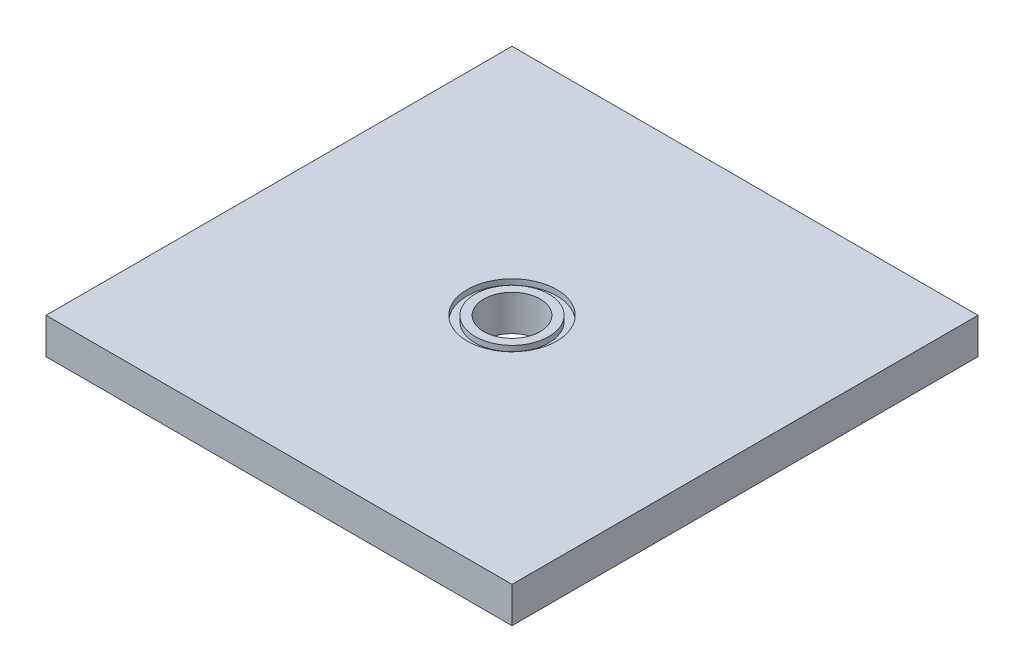
ISO-10303-21;
HEADER;
FILE_DESCRIPTION(('STEP AP214'),'2;1');
FILE_NAME('part.step','',(''),(''),'','','');
FILE_SCHEMA(('AUTOMOTIVE_DESIGN { 1 0 10303 214 1 1 1 1 }'));
ENDSEC;
DATA;
#1=APPLICATION_CONTEXT('core data for automotive mechanical design processes');
#2=APPLICATION_PROTOCOL_DEFINITION('international standard','automotive_design',2000,#1);
#3=PRODUCT_CONTEXT('',#1,'mechanical');
#4=PRODUCT('Part','Part','',(#3));
#5=PRODUCT_RELATED_PRODUCT_CATEGORY('part','',(#4));
#6=PRODUCT_DEFINITION_FORMATION('','',#4);
#7=PRODUCT_DEFINITION_CONTEXT('part definition',#1,'design');
#8=PRODUCT_DEFINITION('design','',#6,#7);
#9=PRODUCT_DEFINITION_SHAPE('','',#8);
#10=(LENGTH_UNIT() NAMED_UNIT(*) SI_UNIT(.MILLI.,.METRE.));
#11=(NAMED_UNIT(*) PLANE_ANGLE_UNIT() SI_UNIT($,.RADIAN.));
#12=(NAMED_UNIT(*) SI_UNIT($,.STERADIAN.) SOLID_ANGLE_UNIT());
#13=UNCERTAINTY_MEASURE_WITH_UNIT(LENGTH_MEASURE(1.E-05),#10,'distance_accuracy_value','');
#14=(GEOMETRIC_REPRESENTATION_CONTEXT(3) GLOBAL_UNCERTAINTY_ASSIGNED_CONTEXT((#13)) GLOBAL_UNIT_ASSIGNED_CONTEXT((#10,
#11,#12)) REPRESENTATION_CONTEXT('',''));
#15=CARTESIAN_POINT('',(0.,0.,0.));
#16=DIRECTION('',(0.,0.,1.));
#17=DIRECTION('',(1.,0.,0.));
#18=AXIS2_PLACEMENT_3D('',#15,#16,#17);
#19=CARTESIAN_POINT('',(0.,6.35,0.));
#20=DIRECTION('',(0.,-1.,0.));
#21=DIRECTION('',(0.,0.,-1.));
#22=AXIS2_PLACEMENT_3D('',#19,#20,#21);
#23=PLANE('',#22);
#24=CARTESIAN_POINT('',(0.,6.35,0.));
#25=DIRECTION('',(0.,1.,0.));
#26=DIRECTION('',(0.,0.,1.));
#27=AXIS2_PLACEMENT_3D('',#24,#25,#26);
#28=CIRCLE('',#27,4.99999);
#29=CARTESIAN_POINT('',(0.,6.35,4.99999));
#30=VERTEX_POINT('',#29);
#31=EDGE_CURVE('E100',#30,#30,#28,.T.);
#32=ORIENTED_EDGE('',*,*,#31,.F.);
#33=EDGE_LOOP('',(#32));
#34=FACE_BOUND('',#33,.T.);
#35=CARTESIAN_POINT('',(0.,6.35,0.));
#36=DIRECTION('',(0.,1.,0.));
#37=DIRECTION('',(0.,0.,1.));
#38=AXIS2_PLACEMENT_3D('',#35,#36,#37);
#39=CIRCLE('',#38,6.5278);
#40=CARTESIAN_POINT('',(0.,6.35,6.5278));
#41=VERTEX_POINT('',#40);
#42=EDGE_CURVE('E123',#41,#41,#39,.T.);
#43=ORIENTED_EDGE('',*,*,#42,.T.);
#44=EDGE_LOOP('',(#43));
#45=FACE_BOUND('',#44,.T.);
#46=ADVANCED_FACE('F33',(#34,#45),#23,.F.);
#47=CARTESIAN_POINT('',(41.275,6.35,41.275));
#48=DIRECTION('',(-1.,0.,0.));
#49=DIRECTION('',(0.,0.,1.));
#50=AXIS2_PLACEMENT_3D('',#47,#48,#49);
#51=PLANE('',#50);
#52=DIRECTION('',(0.,0.,-1.));
#53=VECTOR('',#52,1.);
#54=CARTESIAN_POINT('',(41.275,0.,41.275));
#55=LINE('',#54,#53);
#56=CARTESIAN_POINT('',(41.275,0.,41.275));
#57=VERTEX_POINT('',#56);
#58=CARTESIAN_POINT('',(41.275,0.,-41.275));
#59=VERTEX_POINT('',#58);
#60=EDGE_CURVE('E97',#57,#59,#55,.T.);
#61=ORIENTED_EDGE('',*,*,#60,.T.);
#62=DIRECTION('',(0.,-1.,0.));
#63=VECTOR('',#62,1.);
#64=CARTESIAN_POINT('',(41.275,6.35,-41.275));
#65=LINE('',#64,#63);
#66=CARTESIAN_POINT('',(41.275,6.35,-41.275));
#67=VERTEX_POINT('',#66);
#68=EDGE_CURVE('E11',#67,#59,#65,.T.);
#69=ORIENTED_EDGE('',*,*,#68,.F.);
#70=DIRECTION('',(0.,0.,-1.));
#71=VECTOR('',#70,1.);
#72=CARTESIAN_POINT('',(41.275,6.35,41.275));
#73=LINE('',#72,#71);
#74=CARTESIAN_POINT('',(41.275,6.35,41.275));
#75=VERTEX_POINT('',#74);
#76=EDGE_CURVE('E85',#75,#67,#73,.T.);
#77=ORIENTED_EDGE('',*,*,#76,.F.);
#78=DIRECTION('',(0.,-1.,0.));
#79=VECTOR('',#78,1.);
#80=CARTESIAN_POINT('',(41.275,6.35,41.275));
#81=LINE('',#80,#79);
#82=EDGE_CURVE('E93',#75,#57,#81,.T.);
#83=ORIENTED_EDGE('',*,*,#82,.T.);
#84=EDGE_LOOP('',(#61,#69,#77,#83));
#85=FACE_BOUND('',#84,.T.);
#86=ADVANCED_FACE('F35',(#85),#51,.F.);
#87=CARTESIAN_POINT('',(-41.275,6.35,-41.275));
#88=DIRECTION('',(0.,0.,1.));
#89=DIRECTION('',(1.,0.,0.));
#90=AXIS2_PLACEMENT_3D('',#87,#88,#89);
#91=PLANE('',#90);
#92=DIRECTION('',(-1.,0.,0.));
#93=VECTOR('',#92,1.);
#94=CARTESIAN_POINT('',(-41.275,0.,-41.275));
#95=LINE('',#94,#93);
#96=CARTESIAN_POINT('',(-41.275,0.,-41.275));
#97=VERTEX_POINT('',#96);
#98=EDGE_CURVE('E89',#59,#97,#95,.T.);
#99=ORIENTED_EDGE('',*,*,#98,.T.);
#100=DIRECTION('',(0.,-1.,0.));
#101=VECTOR('',#100,1.);
#102=CARTESIAN_POINT('',(-41.275,6.35,-41.275));
#103=LINE('',#102,#101);
#104=CARTESIAN_POINT('',(-41.275,6.35,-41.275));
#105=VERTEX_POINT('',#104);
#106=EDGE_CURVE('E42',#105,#97,#103,.T.);
#107=ORIENTED_EDGE('',*,*,#106,.F.);
#108=DIRECTION('',(-1.,0.,0.));
#109=VECTOR('',#108,1.);
#110=CARTESIAN_POINT('',(-41.275,6.35,-41.275));
#111=LINE('',#110,#109);
#112=EDGE_CURVE('E80',#67,#105,#111,.T.);
#113=ORIENTED_EDGE('',*,*,#112,.F.);
#114=ORIENTED_EDGE('',*,*,#68,.T.);
#115=EDGE_LOOP('',(#99,#107,#113,#114));
#116=FACE_BOUND('',#115,.T.);
#117=ADVANCED_FACE('F88',(#116),#91,.F.);
#118=CARTESIAN_POINT('',(-41.275,6.35,41.275));
#119=DIRECTION('',(1.,0.,0.));
#120=DIRECTION('',(0.,0.,-1.));
#121=AXIS2_PLACEMENT_3D('',#118,#119,#120);
#122=PLANE('',#121);
#123=DIRECTION('',(0.,0.,1.));
#124=VECTOR('',#123,1.);
#125=CARTESIAN_POINT('',(-41.275,0.,41.275));
#126=LINE('',#125,#124);
#127=CARTESIAN_POINT('',(-41.275,0.,41.275));
#128=VERTEX_POINT('',#127);
#129=EDGE_CURVE('E67',#97,#128,#126,.T.);
#130=ORIENTED_EDGE('',*,*,#129,.T.);
#131=DIRECTION('',(0.,-1.,0.));
#132=VECTOR('',#131,1.);
#133=CARTESIAN_POINT('',(-41.275,6.35,41.275));
#134=LINE('',#133,#132);
#135=CARTESIAN_POINT('',(-41.275,6.35,41.275));
#136=VERTEX_POINT('',#135);
#137=EDGE_CURVE('E90',#136,#128,#134,.T.);
#138=ORIENTED_EDGE('',*,*,#137,.F.);
#139=DIRECTION('',(0.,0.,1.));
#140=VECTOR('',#139,1.);
#141=CARTESIAN_POINT('',(-41.275,6.35,41.275));
#142=LINE('',#141,#140);
#143=EDGE_CURVE('E83',#105,#136,#142,.T.);
#144=ORIENTED_EDGE('',*,*,#143,.F.);
#145=ORIENTED_EDGE('',*,*,#106,.T.);
#146=EDGE_LOOP('',(#130,#138,#144,#145));
#147=FACE_BOUND('',#146,.T.);
#148=ADVANCED_FACE('F91',(#147),#122,.F.);
#149=CARTESIAN_POINT('',(-41.275,6.35,41.275));
#150=DIRECTION('',(0.,0.,-1.));
#151=DIRECTION('',(-1.,0.,0.));
#152=AXIS2_PLACEMENT_3D('',#149,#150,#151);
#153=PLANE('',#152);
#154=DIRECTION('',(1.,0.,0.));
#155=VECTOR('',#154,1.);
#156=CARTESIAN_POINT('',(-41.275,0.,41.275));
#157=LINE('',#156,#155);
#158=EDGE_CURVE('E73',#128,#57,#157,.T.);
#159=ORIENTED_EDGE('',*,*,#158,.T.);
#160=ORIENTED_EDGE('',*,*,#82,.F.);
#161=DIRECTION('',(1.,0.,0.));
#162=VECTOR('',#161,1.);
#163=CARTESIAN_POINT('',(-41.275,6.35,41.275));
#164=LINE('',#163,#162);
#165=EDGE_CURVE('E50',#136,#75,#164,.T.);
#166=ORIENTED_EDGE('',*,*,#165,.F.);
#167=ORIENTED_EDGE('',*,*,#137,.T.);
#168=EDGE_LOOP('',(#159,#160,#166,#167));
#169=FACE_BOUND('',#168,.T.);
#170=ADVANCED_FACE('F105',(#169),#153,.F.);
#171=CARTESIAN_POINT('',(0.,6.35,0.));
#172=DIRECTION('',(0.,1.,0.));
#173=DIRECTION('',(0.,0.,1.));
#174=AXIS2_PLACEMENT_3D('',#171,#172,#173);
#175=CIRCLE('',#174,7.9248);
#176=CARTESIAN_POINT('',(0.,6.35,7.9248));
#177=VERTEX_POINT('',#176);
#178=EDGE_CURVE('E117',#177,#177,#175,.T.);
#179=ORIENTED_EDGE('',*,*,#178,.F.);
#180=EDGE_LOOP('',(#179));
#181=FACE_BOUND('',#180,.T.);
#182=ORIENTED_EDGE('',*,*,#76,.T.);
#183=ORIENTED_EDGE('',*,*,#112,.T.);
#184=ORIENTED_EDGE('',*,*,#143,.T.);
#185=ORIENTED_EDGE('',*,*,#165,.T.);
#186=EDGE_LOOP('',(#182,#183,#184,#185));
#187=FACE_BOUND('',#186,.T.);
#188=ADVANCED_FACE('F81',(#181,#187),#23,.F.);
#189=CARTESIAN_POINT('',(0.,0.,0.));
#190=DIRECTION('',(0.,-1.,0.));
#191=DIRECTION('',(0.,0.,-1.));
#192=AXIS2_PLACEMENT_3D('',#189,#190,#191);
#193=PLANE('',#192);
#194=CARTESIAN_POINT('',(0.,0.,0.));
#195=DIRECTION('',(0.,-1.,0.));
#196=DIRECTION('',(0.,0.,-1.));
#197=AXIS2_PLACEMENT_3D('',#194,#195,#196);
#198=CIRCLE('',#197,4.99999);
#199=CARTESIAN_POINT('',(0.,0.,-4.99999));
#200=VERTEX_POINT('',#199);
#201=EDGE_CURVE('E111',#200,#200,#198,.F.);
#202=ORIENTED_EDGE('',*,*,#201,.T.);
#203=EDGE_LOOP('',(#202));
#204=FACE_BOUND('',#203,.T.);
#205=ORIENTED_EDGE('',*,*,#60,.F.);
#206=ORIENTED_EDGE('',*,*,#158,.F.);
#207=ORIENTED_EDGE('',*,*,#129,.F.);
#208=ORIENTED_EDGE('',*,*,#98,.F.);
#209=EDGE_LOOP('',(#205,#206,#207,#208));
#210=FACE_BOUND('',#209,.T.);
#211=ADVANCED_FACE('F108',(#204,#210),#193,.T.);
#212=CARTESIAN_POINT('',(0.,-0.00100000000000013,0.));
#213=DIRECTION('',(0.,1.,0.));
#214=DIRECTION('',(0.,0.,1.));
#215=AXIS2_PLACEMENT_3D('',#212,#213,#214);
#216=CYLINDRICAL_SURFACE('',#215,4.99999);
#217=ORIENTED_EDGE('',*,*,#201,.F.);
#218=EDGE_LOOP('',(#217));
#219=FACE_BOUND('',#218,.T.);
#220=ORIENTED_EDGE('',*,*,#31,.T.);
#221=EDGE_LOOP('',(#220));
#222=FACE_BOUND('',#221,.T.);
#223=ADVANCED_FACE('F141',(#219,#222),#216,.F.);
#224=CARTESIAN_POINT('',(0.,5.3721,0.));
#225=DIRECTION('',(0.,1.,0.));
#226=DIRECTION('',(0.,0.,1.));
#227=AXIS2_PLACEMENT_3D('',#224,#225,#226);
#228=CYLINDRICAL_SURFACE('',#227,7.9248);
#229=CARTESIAN_POINT('',(0.,5.3721,0.));
#230=DIRECTION('',(0.,1.,0.));
#231=DIRECTION('',(0.,0.,1.));
#232=AXIS2_PLACEMENT_3D('',#229,#230,#231);
#233=CIRCLE('',#232,7.9248);
#234=CARTESIAN_POINT('',(0.,5.3721,7.9248));
#235=VERTEX_POINT('',#234);
#236=EDGE_CURVE('E114',#235,#235,#233,.T.);
#237=ORIENTED_EDGE('',*,*,#236,.F.);
#238=EDGE_LOOP('',(#237));
#239=FACE_BOUND('',#238,.T.);
#240=ORIENTED_EDGE('',*,*,#178,.T.);
#241=EDGE_LOOP('',(#240));
#242=FACE_BOUND('',#241,.T.);
#243=ADVANCED_FACE('F135',(#239,#242),#228,.F.);
#244=CARTESIAN_POINT('',(0.,5.3721,0.));
#245=DIRECTION('',(0.,1.,0.));
#246=DIRECTION('',(0.,0.,1.));
#247=AXIS2_PLACEMENT_3D('',#244,#245,#246);
#248=PLANE('',#247);
#249=CARTESIAN_POINT('',(0.,5.3721,0.));
#250=DIRECTION('',(0.,1.,0.));
#251=DIRECTION('',(0.,0.,1.));
#252=AXIS2_PLACEMENT_3D('',#249,#250,#251);
#253=CIRCLE('',#252,6.5278);
#254=CARTESIAN_POINT('',(0.,5.3721,6.5278));
#255=VERTEX_POINT('',#254);
#256=EDGE_CURVE('E120',#255,#255,#253,.T.);
#257=ORIENTED_EDGE('',*,*,#256,.F.);
#258=EDGE_LOOP('',(#257));
#259=FACE_BOUND('',#258,.T.);
#260=ORIENTED_EDGE('',*,*,#236,.T.);
#261=EDGE_LOOP('',(#260));
#262=FACE_BOUND('',#261,.T.);
#263=ADVANCED_FACE('F132',(#259,#262),#248,.T.);
#264=CARTESIAN_POINT('',(0.,5.3721,0.));
#265=DIRECTION('',(0.,1.,0.));
#266=DIRECTION('',(0.,0.,1.));
#267=AXIS2_PLACEMENT_3D('',#264,#265,#266);
#268=CYLINDRICAL_SURFACE('',#267,6.5278);
#269=ORIENTED_EDGE('',*,*,#256,.T.);
#270=EDGE_LOOP('',(#269));
#271=FACE_BOUND('',#270,.T.);
#272=ORIENTED_EDGE('',*,*,#42,.F.);
#273=EDGE_LOOP('',(#272));
#274=FACE_BOUND('',#273,.T.);
#275=ADVANCED_FACE('F129',(#271,#274),#268,.T.);
#276=CLOSED_SHELL('',(#46,#86,#117,#148,#170,#188,#211,#223,#243,#263,#275));
#277=MANIFOLD_SOLID_BREP('B2',#276);
#278=ADVANCED_BREP_SHAPE_REPRESENTATION('',(#18,#277),#14);
#279=SHAPE_DEFINITION_REPRESENTATION(#9,#278);
ENDSEC;
END-ISO-10303-21;
